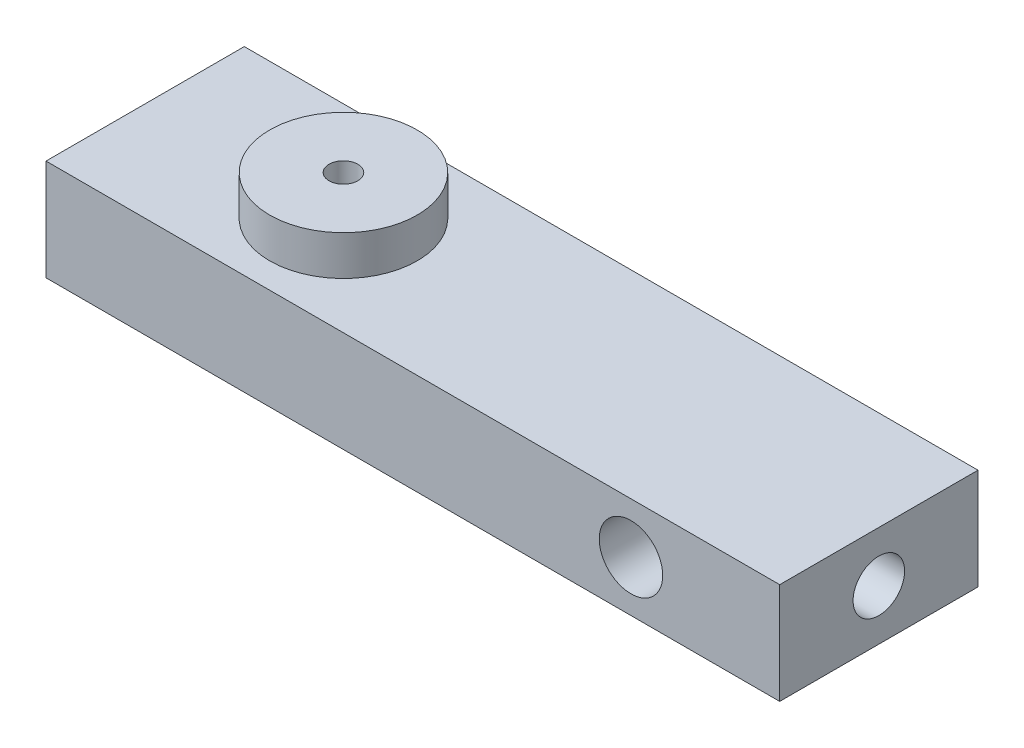
ISO-10303-21;
HEADER;
FILE_DESCRIPTION(('STEP AP214'),'2;1');
FILE_NAME('part.step','',(''),(''),'','','');
FILE_SCHEMA(('AUTOMOTIVE_DESIGN { 1 0 10303 214 1 1 1 1 }'));
ENDSEC;
DATA;
#1=APPLICATION_CONTEXT('core data for automotive mechanical design processes');
#2=APPLICATION_PROTOCOL_DEFINITION('international standard','automotive_design',2000,#1);
#3=PRODUCT_CONTEXT('',#1,'mechanical');
#4=PRODUCT('Part','Part','',(#3));
#5=PRODUCT_RELATED_PRODUCT_CATEGORY('part','',(#4));
#6=PRODUCT_DEFINITION_FORMATION('','',#4);
#7=PRODUCT_DEFINITION_CONTEXT('part definition',#1,'design');
#8=PRODUCT_DEFINITION('design','',#6,#7);
#9=PRODUCT_DEFINITION_SHAPE('','',#8);
#10=(LENGTH_UNIT() NAMED_UNIT(*) SI_UNIT(.MILLI.,.METRE.));
#11=(NAMED_UNIT(*) PLANE_ANGLE_UNIT() SI_UNIT($,.RADIAN.));
#12=(NAMED_UNIT(*) SI_UNIT($,.STERADIAN.) SOLID_ANGLE_UNIT());
#13=UNCERTAINTY_MEASURE_WITH_UNIT(LENGTH_MEASURE(1.E-05),#10,'distance_accuracy_value','');
#14=(GEOMETRIC_REPRESENTATION_CONTEXT(3) GLOBAL_UNCERTAINTY_ASSIGNED_CONTEXT((#13)) GLOBAL_UNIT_ASSIGNED_CONTEXT((#10,
#11,#12)) REPRESENTATION_CONTEXT('',''));
#15=CARTESIAN_POINT('',(0.,0.,0.));
#16=DIRECTION('',(0.,0.,1.));
#17=DIRECTION('',(1.,0.,0.));
#18=AXIS2_PLACEMENT_3D('',#15,#16,#17);
#19=CARTESIAN_POINT('',(7.5,5.1,-5.));
#20=DIRECTION('',(-1.,0.,0.));
#21=DIRECTION('',(0.,0.,1.));
#22=AXIS2_PLACEMENT_3D('',#19,#20,#21);
#23=PLANE('',#22);
#24=CARTESIAN_POINT('',(7.5,2.55,0.));
#25=DIRECTION('',(1.,0.,0.));
#26=DIRECTION('',(0.,0.,-1.));
#27=AXIS2_PLACEMENT_3D('',#24,#25,#26);
#28=CIRCLE('',#27,1.3);
#29=CARTESIAN_POINT('',(7.5,2.55,-1.3));
#30=VERTEX_POINT('',#29);
#31=EDGE_CURVE('E157',#30,#30,#28,.T.);
#32=ORIENTED_EDGE('',*,*,#31,.F.);
#33=EDGE_LOOP('',(#32));
#34=FACE_BOUND('',#33,.T.);
#35=DIRECTION('',(0.,0.,-1.));
#36=VECTOR('',#35,1.);
#37=CARTESIAN_POINT('',(7.5,0.,-5.));
#38=LINE('',#37,#36);
#39=CARTESIAN_POINT('',(7.5,0.,5.));
#40=VERTEX_POINT('',#39);
#41=CARTESIAN_POINT('',(7.5,0.,-5.));
#42=VERTEX_POINT('',#41);
#43=EDGE_CURVE('E88',#40,#42,#38,.T.);
#44=ORIENTED_EDGE('',*,*,#43,.T.);
#45=DIRECTION('',(0.,-1.,0.));
#46=VECTOR('',#45,1.);
#47=CARTESIAN_POINT('',(7.5,5.1,-5.));
#48=LINE('',#47,#46);
#49=CARTESIAN_POINT('',(7.5,5.1,-5.));
#50=VERTEX_POINT('',#49);
#51=EDGE_CURVE('E11',#50,#42,#48,.T.);
#52=ORIENTED_EDGE('',*,*,#51,.F.);
#53=DIRECTION('',(0.,0.,-1.));
#54=VECTOR('',#53,1.);
#55=CARTESIAN_POINT('',(7.5,5.1,-5.));
#56=LINE('',#55,#54);
#57=CARTESIAN_POINT('',(7.5,5.1,5.));
#58=VERTEX_POINT('',#57);
#59=EDGE_CURVE('E171',#58,#50,#56,.T.);
#60=ORIENTED_EDGE('',*,*,#59,.F.);
#61=DIRECTION('',(0.,-1.,0.));
#62=VECTOR('',#61,1.);
#63=CARTESIAN_POINT('',(7.5,5.1,5.));
#64=LINE('',#63,#62);
#65=EDGE_CURVE('E47',#58,#40,#64,.T.);
#66=ORIENTED_EDGE('',*,*,#65,.T.);
#67=EDGE_LOOP('',(#44,#52,#60,#66));
#68=FACE_BOUND('',#67,.T.);
#69=ADVANCED_FACE('F38',(#34,#68),#23,.F.);
#70=CARTESIAN_POINT('',(-7.5,5.1,-5.));
#71=DIRECTION('',(0.,0.,1.));
#72=DIRECTION('',(1.,0.,0.));
#73=AXIS2_PLACEMENT_3D('',#70,#71,#72);
#74=PLANE('',#73);
#75=CARTESIAN_POINT('',(0.,2.55,-5.));
#76=DIRECTION('',(0.,0.,1.));
#77=DIRECTION('',(1.,0.,0.));
#78=AXIS2_PLACEMENT_3D('',#75,#76,#77);
#79=CIRCLE('',#78,1.6);
#80=CARTESIAN_POINT('',(1.6,2.55,-5.));
#81=VERTEX_POINT('',#80);
#82=EDGE_CURVE('E161',#81,#81,#79,.T.);
#83=ORIENTED_EDGE('',*,*,#82,.T.);
#84=EDGE_LOOP('',(#83));
#85=FACE_BOUND('',#84,.T.);
#86=DIRECTION('',(-1.,0.,0.));
#87=VECTOR('',#86,1.);
#88=CARTESIAN_POINT('',(-7.5,0.,-5.));
#89=LINE('',#88,#87);
#90=CARTESIAN_POINT('',(-29.5,0.,-5.));
#91=VERTEX_POINT('',#90);
#92=EDGE_CURVE('E67',#42,#91,#89,.T.);
#93=ORIENTED_EDGE('',*,*,#92,.T.);
#94=DIRECTION('',(0.,-1.,0.));
#95=VECTOR('',#94,1.);
#96=CARTESIAN_POINT('',(-29.5,5.1,-5.));
#97=LINE('',#96,#95);
#98=CARTESIAN_POINT('',(-29.5,5.1,-5.));
#99=VERTEX_POINT('',#98);
#100=EDGE_CURVE('E83',#99,#91,#97,.T.);
#101=ORIENTED_EDGE('',*,*,#100,.F.);
#102=DIRECTION('',(-1.,0.,0.));
#103=VECTOR('',#102,1.);
#104=CARTESIAN_POINT('',(-7.5,5.1,-5.));
#105=LINE('',#104,#103);
#106=EDGE_CURVE('E71',#50,#99,#105,.T.);
#107=ORIENTED_EDGE('',*,*,#106,.F.);
#108=ORIENTED_EDGE('',*,*,#51,.T.);
#109=EDGE_LOOP('',(#93,#101,#107,#108));
#110=FACE_BOUND('',#109,.T.);
#111=ADVANCED_FACE('F81',(#85,#110),#74,.F.);
#112=CARTESIAN_POINT('',(-7.5,5.1,5.));
#113=DIRECTION('',(0.,0.,-1.));
#114=DIRECTION('',(-1.,0.,0.));
#115=AXIS2_PLACEMENT_3D('',#112,#113,#114);
#116=PLANE('',#115);
#117=CARTESIAN_POINT('',(0.,2.55,5.));
#118=DIRECTION('',(0.,0.,1.));
#119=DIRECTION('',(1.,0.,0.));
#120=AXIS2_PLACEMENT_3D('',#117,#118,#119);
#121=CIRCLE('',#120,1.6);
#122=CARTESIAN_POINT('',(1.6,2.55,5.));
#123=VERTEX_POINT('',#122);
#124=EDGE_CURVE('E165',#123,#123,#121,.T.);
#125=ORIENTED_EDGE('',*,*,#124,.F.);
#126=EDGE_LOOP('',(#125));
#127=FACE_BOUND('',#126,.T.);
#128=DIRECTION('',(1.,0.,0.));
#129=VECTOR('',#128,1.);
#130=CARTESIAN_POINT('',(-7.5,0.,5.));
#131=LINE('',#130,#129);
#132=CARTESIAN_POINT('',(-29.5,0.,5.));
#133=VERTEX_POINT('',#132);
#134=EDGE_CURVE('E87',#133,#40,#131,.T.);
#135=ORIENTED_EDGE('',*,*,#134,.T.);
#136=ORIENTED_EDGE('',*,*,#65,.F.);
#137=DIRECTION('',(1.,0.,0.));
#138=VECTOR('',#137,1.);
#139=CARTESIAN_POINT('',(-7.5,5.1,5.));
#140=LINE('',#139,#138);
#141=CARTESIAN_POINT('',(-29.5,5.1,5.));
#142=VERTEX_POINT('',#141);
#143=EDGE_CURVE('E55',#142,#58,#140,.T.);
#144=ORIENTED_EDGE('',*,*,#143,.F.);
#145=DIRECTION('',(0.,1.,0.));
#146=VECTOR('',#145,1.);
#147=CARTESIAN_POINT('',(-29.5,0.,5.));
#148=LINE('',#147,#146);
#149=EDGE_CURVE('E97',#133,#142,#148,.T.);
#150=ORIENTED_EDGE('',*,*,#149,.F.);
#151=EDGE_LOOP('',(#135,#136,#144,#150));
#152=FACE_BOUND('',#151,.T.);
#153=ADVANCED_FACE('F152',(#127,#152),#116,.F.);
#154=CARTESIAN_POINT('',(0.,5.1,0.));
#155=DIRECTION('',(0.,1.,0.));
#156=DIRECTION('',(0.,0.,1.));
#157=AXIS2_PLACEMENT_3D('',#154,#155,#156);
#158=PLANE('',#157);
#159=CARTESIAN_POINT('',(-19.5,5.1,0.));
#160=DIRECTION('',(0.,1.,0.));
#161=DIRECTION('',(0.,0.,1.));
#162=AXIS2_PLACEMENT_3D('',#159,#160,#161);
#163=CIRCLE('',#162,3.72);
#164=CARTESIAN_POINT('',(-19.5,5.1,3.72));
#165=VERTEX_POINT('',#164);
#166=EDGE_CURVE('E106',#165,#165,#163,.T.);
#167=ORIENTED_EDGE('',*,*,#166,.F.);
#168=EDGE_LOOP('',(#167));
#169=FACE_BOUND('',#168,.T.);
#170=ORIENTED_EDGE('',*,*,#59,.T.);
#171=ORIENTED_EDGE('',*,*,#106,.T.);
#172=DIRECTION('',(0.,0.,-1.));
#173=VECTOR('',#172,1.);
#174=CARTESIAN_POINT('',(-29.5,5.1,5.));
#175=LINE('',#174,#173);
#176=EDGE_CURVE('E100',#142,#99,#175,.T.);
#177=ORIENTED_EDGE('',*,*,#176,.F.);
#178=ORIENTED_EDGE('',*,*,#143,.T.);
#179=EDGE_LOOP('',(#170,#171,#177,#178));
#180=FACE_BOUND('',#179,.T.);
#181=ADVANCED_FACE('F202',(#169,#180),#158,.T.);
#182=CARTESIAN_POINT('',(0.,0.,0.));
#183=DIRECTION('',(0.,1.,0.));
#184=DIRECTION('',(0.,0.,1.));
#185=AXIS2_PLACEMENT_3D('',#182,#183,#184);
#186=PLANE('',#185);
#187=CARTESIAN_POINT('',(-19.5,0.,0.));
#188=DIRECTION('',(0.,1.,0.));
#189=DIRECTION('',(0.,0.,1.));
#190=AXIS2_PLACEMENT_3D('',#187,#188,#189);
#191=CIRCLE('',#190,0.725);
#192=CARTESIAN_POINT('',(-19.5,0.,0.725));
#193=VERTEX_POINT('',#192);
#194=EDGE_CURVE('E308',#193,#193,#191,.T.);
#195=ORIENTED_EDGE('',*,*,#194,.T.);
#196=EDGE_LOOP('',(#195));
#197=FACE_BOUND('',#196,.T.);
#198=ORIENTED_EDGE('',*,*,#43,.F.);
#199=ORIENTED_EDGE('',*,*,#134,.F.);
#200=DIRECTION('',(0.,0.,1.));
#201=VECTOR('',#200,1.);
#202=CARTESIAN_POINT('',(-29.5,0.,-5.));
#203=LINE('',#202,#201);
#204=EDGE_CURVE('E91',#91,#133,#203,.T.);
#205=ORIENTED_EDGE('',*,*,#204,.F.);
#206=ORIENTED_EDGE('',*,*,#92,.F.);
#207=EDGE_LOOP('',(#198,#199,#205,#206));
#208=FACE_BOUND('',#207,.T.);
#209=ADVANCED_FACE('F92',(#197,#208),#186,.F.);
#210=CARTESIAN_POINT('',(0.,2.55,-5.));
#211=DIRECTION('',(0.,0.,1.));
#212=DIRECTION('',(1.,0.,0.));
#213=AXIS2_PLACEMENT_3D('',#210,#211,#212);
#214=CYLINDRICAL_SURFACE('',#213,1.6);
#215=CARTESIAN_POINT('',(1.6,2.55,-0.575));
#216=CARTESIAN_POINT('',(1.60000050848022,2.51876950559372,-0.575000703116482));
#217=CARTESIAN_POINT('',(1.59907746887212,2.48754399785527,-0.572447532186191));
#218=CARTESIAN_POINT('',(1.59548698202028,2.42602110960908,-0.56233968613379));
#219=CARTESIAN_POINT('',(1.59281962457341,2.39572368140817,-0.554785268473904));
#220=CARTESIAN_POINT('',(1.58602819566392,2.3369528443925,-0.534973175694512));
#221=CARTESIAN_POINT('',(1.58190679254388,2.30847620653527,-0.522724112263412));
#222=CARTESIAN_POINT('',(1.57262165183787,2.25398282368175,-0.493912354762376));
#223=CARTESIAN_POINT('',(1.56745766069616,2.227966679338,-0.477348611084163));
#224=CARTESIAN_POINT('',(1.55639653521282,2.17810551570974,-0.439693044044112));
#225=CARTESIAN_POINT('',(1.55047984690046,2.15437074608225,-0.41846102510401));
#226=CARTESIAN_POINT('',(1.53868066195895,2.1107116824926,-0.372369329098642));
#227=CARTESIAN_POINT('',(1.53279817500993,2.09078842083366,-0.347508672463478));
#228=CARTESIAN_POINT('',(1.52151080468376,2.05464511832147,-0.293821223420627));
#229=CARTESIAN_POINT('',(1.51612929847291,2.03857596703836,-0.26488744956286));
#230=CARTESIAN_POINT('',(1.50675477543481,2.0115802941203,-0.204503778235171));
#231=CARTESIAN_POINT('',(1.50276125549563,2.00065190857156,-0.173054797563123));
#232=CARTESIAN_POINT('',(1.49682268207155,1.98467493191648,-0.109797426572945));
#233=CARTESIAN_POINT('',(1.49480507491347,1.97941730430619,-0.0780488631075839));
#234=CARTESIAN_POINT('',(1.492833494102,1.97427742205493,-0.0140609639627082));
#235=CARTESIAN_POINT('',(1.49287875507453,1.97439317376032,0.0181781852595003));
#236=CARTESIAN_POINT('',(1.49496483898098,1.979835986849,0.0803719103053698));
#237=CARTESIAN_POINT('',(1.49689727836497,1.98488001723853,0.110355547797764));
#238=CARTESIAN_POINT('',(1.50236093239943,1.99957070667126,0.169018417895657));
#239=CARTESIAN_POINT('',(1.50589236813211,2.00921800218614,0.197697469521444));
#240=CARTESIAN_POINT('',(1.51422589703627,2.03300807086108,0.253539299394918));
#241=CARTESIAN_POINT('',(1.51904960582178,2.04722823051598,0.280665742064256));
#242=CARTESIAN_POINT('',(1.52941625088347,2.07970655062852,0.332232357347461));
#243=CARTESIAN_POINT('',(1.53495942036609,2.09796602174868,0.356671654182978));
#244=CARTESIAN_POINT('',(1.54655543660516,2.13932446438426,0.403746477475306));
#245=CARTESIAN_POINT('',(1.55261869343905,2.16265153931204,0.426179495108066));
#246=CARTESIAN_POINT('',(1.56427752502767,2.21280863216884,0.466872595705891));
#247=CARTESIAN_POINT('',(1.56987303910187,2.23963910344221,0.485132137774929));
#248=CARTESIAN_POINT('',(1.58006156395632,2.29652394538056,0.517159266945663));
#249=CARTESIAN_POINT('',(1.58464040681923,2.32661610885396,0.530864552064318));
#250=CARTESIAN_POINT('',(1.59217557088174,2.38888389671438,0.552952662760458));
#251=CARTESIAN_POINT('',(1.5951325514512,2.42105866845793,0.561337651527926));
#252=CARTESIAN_POINT('',(1.59897748647025,2.48487007617423,0.572169743648096));
#253=CARTESIAN_POINT('',(1.59996049684922,2.51645468563876,0.574889894823188));
#254=CARTESIAN_POINT('',(1.60003712063751,2.57964040106482,0.575103475521332));
#255=CARTESIAN_POINT('',(1.59913111302775,2.61124150244605,0.572597953435887));
#256=CARTESIAN_POINT('',(1.59559431878588,2.67241712819422,0.562642399374702));
#257=CARTESIAN_POINT('',(1.59302443425764,2.70202392779867,0.555366848124368));
#258=CARTESIAN_POINT('',(1.58647914641158,2.75957941952705,0.536302982595821));
#259=CARTESIAN_POINT('',(1.58250356047261,2.78752789565935,0.524514081951115));
#260=CARTESIAN_POINT('',(1.57340345933439,2.84185996795856,0.496392002318815));
#261=CARTESIAN_POINT('',(1.56824955041595,2.86817667950566,0.479939397357719));
#262=CARTESIAN_POINT('',(1.55736883934702,2.91776040386426,0.443093818789814));
#263=CARTESIAN_POINT('',(1.55164183904692,2.9410263553897,0.422699480020255));
#264=CARTESIAN_POINT('',(1.53987093336245,2.98513962523005,0.37727078984231));
#265=CARTESIAN_POINT('',(1.53382636840347,3.0057925748739,0.352047386795197));
#266=CARTESIAN_POINT('',(1.52240352755619,3.04260545505542,0.298368769841877));
#267=CARTESIAN_POINT('',(1.51702528726837,3.05876514558399,0.269913383412381));
#268=CARTESIAN_POINT('',(1.50758047664489,3.08610804134641,0.210440677446993));
#269=CARTESIAN_POINT('',(1.50351577160119,3.0972841781358,0.179419792535327));
#270=CARTESIAN_POINT('',(1.49725518959262,3.11418945864788,0.115751947660128));
#271=CARTESIAN_POINT('',(1.49505828290862,3.11992160385302,0.083105894176319));
#272=CARTESIAN_POINT('',(1.49291142107151,3.12552028647244,0.0192008486922548));
#273=CARTESIAN_POINT('',(1.49283583907789,3.12571477938626,-0.0120254613139569));
#274=CARTESIAN_POINT('',(1.49462250280095,3.12106011770636,-0.0740404171482503));
#275=CARTESIAN_POINT('',(1.49648459396689,3.11621136536689,-0.104829097683559));
#276=CARTESIAN_POINT('',(1.50183628738895,3.10185482014829,-0.164296530149276));
#277=CARTESIAN_POINT('',(1.50528280328148,3.09247005100604,-0.193009180628924));
#278=CARTESIAN_POINT('',(1.51339328258353,3.06941256432135,-0.248471636084732));
#279=CARTESIAN_POINT('',(1.51805754085538,3.05573880808819,-0.275220963652289));
#280=CARTESIAN_POINT('',(1.52836370725024,3.02370907177732,-0.327426540976942));
#281=CARTESIAN_POINT('',(1.53404242472571,3.00515582893766,-0.352754424824735));
#282=CARTESIAN_POINT('',(1.54560096415055,2.96420980015171,-0.400042628356791));
#283=CARTESIAN_POINT('',(1.55148084685939,2.94181584582228,-0.422001919418773));
#284=CARTESIAN_POINT('',(1.56311841941566,2.89253604868526,-0.46300062424063));
#285=CARTESIAN_POINT('',(1.5688566747583,2.86548611591526,-0.481849128630608));
#286=CARTESIAN_POINT('',(1.57926174757605,2.80840446522642,-0.51471978565845));
#287=CARTESIAN_POINT('',(1.58392862653151,2.77837291854762,-0.528742215261063));
#288=CARTESIAN_POINT('',(1.59169242403267,2.71587446359602,-0.551567499047618));
#289=CARTESIAN_POINT('',(1.59477488465317,2.68338812663372,-0.56032240578293));
#290=CARTESIAN_POINT('',(1.59892799377825,2.61726561992664,-0.572037110815618));
#291=CARTESIAN_POINT('',(1.59999945245348,2.58362991878844,-0.574999242863405));
#292=CARTESIAN_POINT('',(1.6,2.55,-0.575));
#293=B_SPLINE_CURVE_WITH_KNOTS('',3,(#215,#216,#217,#218,#219,#220,#221,#222,#223,#224,#225,
#226,#227,#228,#229,#230,#231,#232,#233,#234,#235,#236,#237,#238,#239,#240,#241,#242,#243,#244,
#245,#246,#247,#248,#249,#250,#251,#252,#253,#254,#255,#256,#257,#258,#259,#260,#261,#262,#263,
#264,#265,#266,#267,#268,#269,#270,#271,#272,#273,#274,#275,#276,#277,#278,#279,#280,#281,#282,
#283,#284,#285,#286,#287,#288,#289,#290,#291,#292),.UNSPECIFIED.,.T.,.F.,(4,2,2,2,2,2,2,2,2,2,2,
2,2,2,2,2,2,2,2,2,2,2,2,2,2,2,2,2,2,2,2,2,2,2,2,2,2,2,4),(0.,0.0935675457078228,
0.187130274969539,0.280522191284918,0.373936847783771,0.470676735992777,0.567442788112722,
0.667536112098638,0.767593116709176,0.863820495215789,0.960012171323757,1.05098587658739,
1.14197216400118,1.23458729307956,1.32723251780535,1.42555887098333,1.52389796036016,
1.62353169774568,1.72312489884662,1.81779471290386,1.91244553582319,2.00381402123083,
2.09519438110339,2.18916704085329,2.28317230519053,2.38217575182213,2.48118448574416,
2.58033320588447,2.67942722972459,2.7726395891547,2.86584451444461,2.95665248106322,
3.0474824562145,3.14278117332156,3.23810893284895,3.33801547788619,3.43791628840662,
3.53871320189027,3.63946949868315),.UNSPECIFIED.);
#294=CARTESIAN_POINT('',(1.6,2.55,-0.575));
#295=VERTEX_POINT('',#294);
#296=EDGE_CURVE('E114',#295,#295,#293,.T.);
#297=ORIENTED_EDGE('',*,*,#296,.F.);
#298=EDGE_LOOP('',(#297));
#299=FACE_BOUND('',#298,.T.);
#300=ORIENTED_EDGE('',*,*,#82,.F.);
#301=EDGE_LOOP('',(#300));
#302=FACE_BOUND('',#301,.T.);
#303=ORIENTED_EDGE('',*,*,#124,.T.);
#304=EDGE_LOOP('',(#303));
#305=FACE_BOUND('',#304,.T.);
#306=ADVANCED_FACE('F192',(#299,#302,#305),#214,.F.);
#307=CARTESIAN_POINT('',(3.7,2.55,0.));
#308=DIRECTION('',(1.,0.,0.));
#309=DIRECTION('',(0.,0.,-1.));
#310=AXIS2_PLACEMENT_3D('',#307,#308,#309);
#311=CYLINDRICAL_SURFACE('',#310,1.3);
#312=CARTESIAN_POINT('',(3.7,2.55,0.));
#313=DIRECTION('',(1.,0.,0.));
#314=DIRECTION('',(0.,0.,-1.));
#315=AXIS2_PLACEMENT_3D('',#312,#313,#314);
#316=CIRCLE('',#315,1.3);
#317=CARTESIAN_POINT('',(3.7,2.55,-1.3));
#318=VERTEX_POINT('',#317);
#319=EDGE_CURVE('E180',#318,#318,#316,.T.);
#320=CARTESIAN_POINT('',(3.7,2.55,-1.3));
#321=CARTESIAN_POINT('',(3.73958333333333,2.55,-1.3));
#322=CARTESIAN_POINT('',(3.77916666666666,2.55,-1.3));
#323=CARTESIAN_POINT('',(3.85833333333333,2.55,-1.3));
#324=CARTESIAN_POINT('',(3.89791666666666,2.55,-1.3));
#325=CARTESIAN_POINT('',(3.97708333333333,2.55,-1.3));
#326=CARTESIAN_POINT('',(4.01666666666666,2.55,-1.3));
#327=CARTESIAN_POINT('',(4.09583333333333,2.55,-1.3));
#328=CARTESIAN_POINT('',(4.13541666666666,2.55,-1.3));
#329=CARTESIAN_POINT('',(4.21458333333333,2.55,-1.3));
#330=CARTESIAN_POINT('',(4.25416666666666,2.55,-1.3));
#331=CARTESIAN_POINT('',(4.33333333333333,2.55,-1.3));
#332=CARTESIAN_POINT('',(4.37291666666667,2.55,-1.3));
#333=CARTESIAN_POINT('',(4.45208333333333,2.55,-1.3));
#334=CARTESIAN_POINT('',(4.49166666666666,2.55,-1.3));
#335=CARTESIAN_POINT('',(4.57083333333333,2.55,-1.3));
#336=CARTESIAN_POINT('',(4.61041666666666,2.55,-1.3));
#337=CARTESIAN_POINT('',(4.68958333333333,2.55,-1.3));
#338=CARTESIAN_POINT('',(4.72916666666666,2.55,-1.3));
#339=CARTESIAN_POINT('',(4.80833333333333,2.55,-1.3));
#340=CARTESIAN_POINT('',(4.84791666666666,2.55,-1.3));
#341=CARTESIAN_POINT('',(4.92708333333333,2.55,-1.3));
#342=CARTESIAN_POINT('',(4.96666666666666,2.55,-1.3));
#343=CARTESIAN_POINT('',(5.04583333333333,2.55,-1.3));
#344=CARTESIAN_POINT('',(5.08541666666666,2.55,-1.3));
#345=CARTESIAN_POINT('',(5.16458333333333,2.55,-1.3));
#346=CARTESIAN_POINT('',(5.20416666666666,2.55,-1.3));
#347=CARTESIAN_POINT('',(5.28333333333333,2.55,-1.3));
#348=CARTESIAN_POINT('',(5.32291666666666,2.55,-1.3));
#349=CARTESIAN_POINT('',(5.40208333333333,2.55,-1.3));
#350=CARTESIAN_POINT('',(5.44166666666666,2.55,-1.3));
#351=CARTESIAN_POINT('',(5.52083333333333,2.55,-1.3));
#352=CARTESIAN_POINT('',(5.56041666666666,2.55,-1.3));
#353=CARTESIAN_POINT('',(5.63958333333333,2.55,-1.3));
#354=CARTESIAN_POINT('',(5.67916666666666,2.55,-1.3));
#355=CARTESIAN_POINT('',(5.75833333333333,2.55,-1.3));
#356=CARTESIAN_POINT('',(5.79791666666666,2.55,-1.3));
#357=CARTESIAN_POINT('',(5.87708333333333,2.55,-1.3));
#358=CARTESIAN_POINT('',(5.91666666666666,2.55,-1.3));
#359=CARTESIAN_POINT('',(5.99583333333333,2.55,-1.3));
#360=CARTESIAN_POINT('',(6.03541666666666,2.55,-1.3));
#361=CARTESIAN_POINT('',(6.11458333333333,2.55,-1.3));
#362=CARTESIAN_POINT('',(6.15416666666666,2.55,-1.3));
#363=CARTESIAN_POINT('',(6.23333333333333,2.55,-1.3));
#364=CARTESIAN_POINT('',(6.27291666666666,2.55,-1.3));
#365=CARTESIAN_POINT('',(6.35208333333333,2.55,-1.3));
#366=CARTESIAN_POINT('',(6.39166666666666,2.55,-1.3));
#367=CARTESIAN_POINT('',(6.47083333333333,2.55,-1.3));
#368=CARTESIAN_POINT('',(6.51041666666666,2.55,-1.3));
#369=CARTESIAN_POINT('',(6.58958333333333,2.55,-1.3));
#370=CARTESIAN_POINT('',(6.62916666666666,2.55,-1.3));
#371=CARTESIAN_POINT('',(6.70833333333333,2.55,-1.3));
#372=CARTESIAN_POINT('',(6.74791666666666,2.55,-1.3));
#373=CARTESIAN_POINT('',(6.82708333333333,2.55,-1.3));
#374=CARTESIAN_POINT('',(6.86666666666666,2.55,-1.3));
#375=CARTESIAN_POINT('',(6.94583333333333,2.55,-1.3));
#376=CARTESIAN_POINT('',(6.98541666666666,2.55,-1.3));
#377=CARTESIAN_POINT('',(7.06458333333333,2.55,-1.3));
#378=CARTESIAN_POINT('',(7.10416666666666,2.55,-1.3));
#379=CARTESIAN_POINT('',(7.18333333333333,2.55,-1.3));
#380=CARTESIAN_POINT('',(7.22291666666666,2.55,-1.3));
#381=CARTESIAN_POINT('',(7.30208333333333,2.55,-1.3));
#382=CARTESIAN_POINT('',(7.34166666666666,2.55,-1.3));
#383=CARTESIAN_POINT('',(7.42083333333333,2.55,-1.3));
#384=CARTESIAN_POINT('',(7.46041666666666,2.55,-1.3));
#385=CARTESIAN_POINT('',(7.5,2.55,-1.3));
#386=B_SPLINE_CURVE_WITH_KNOTS('',3,(#320,#321,#322,#323,#324,#325,#326,#327,#328,#329,#330,
#331,#332,#333,#334,#335,#336,#337,#338,#339,#340,#341,#342,#343,#344,#345,#346,#347,#348,#349,
#350,#351,#352,#353,#354,#355,#356,#357,#358,#359,#360,#361,#362,#363,#364,#365,#366,#367,#368,
#369,#370,#371,#372,#373,#374,#375,#376,#377,#378,#379,#380,#381,#382,#383,#384,#385),
.UNSPECIFIED.,.F.,.F.,(4,2,2,2,2,2,2,2,2,2,2,2,2,2,2,2,2,2,2,2,2,2,2,2,2,2,2,2,2,2,2,2,4),(0.,
0.11875,0.237499999999999,0.356249999999999,0.474999999999999,0.593749999999999,0.7125,0.83125,
0.95,1.06875,1.1875,1.30625,1.425,1.54375,1.6625,1.78125,1.9,2.01875,2.1375,2.25625,2.375,
2.49375,2.6125,2.73125,2.85,2.96875,3.0875,3.20625,3.325,3.44375,3.5625,3.68125,3.8),.UNSPECIFIED.);
#387=EDGE_CURVE('BSEAM189',#318,#30,#386,.T.);
#388=ORIENTED_EDGE('',*,*,#319,.F.);
#389=ORIENTED_EDGE('',*,*,#31,.T.);
#390=ORIENTED_EDGE('',*,*,#387,.T.);
#391=ORIENTED_EDGE('',*,*,#387,.F.);
#392=EDGE_LOOP('',(#388,#390,#389,#391));
#393=FACE_BOUND('',#392,.T.);
#394=ADVANCED_FACE('F189',(#393),#311,.F.);
#395=CARTESIAN_POINT('',(3.7,2.55,0.));
#396=DIRECTION('',(1.,0.,0.));
#397=DIRECTION('',(0.,0.,-1.));
#398=AXIS2_PLACEMENT_3D('',#395,#396,#397);
#399=PLANE('',#398);
#400=CARTESIAN_POINT('',(3.7,2.55,0.));
#401=DIRECTION('',(1.,0.,0.));
#402=DIRECTION('',(0.,0.,-1.));
#403=AXIS2_PLACEMENT_3D('',#400,#401,#402);
#404=CIRCLE('',#403,0.575);
#405=CARTESIAN_POINT('',(3.7,2.55,-0.575));
#406=VERTEX_POINT('',#405);
#407=EDGE_CURVE('E123',#406,#406,#404,.T.);
#408=ORIENTED_EDGE('',*,*,#407,.F.);
#409=EDGE_LOOP('',(#408));
#410=FACE_BOUND('',#409,.T.);
#411=ORIENTED_EDGE('',*,*,#319,.T.);
#412=EDGE_LOOP('',(#411));
#413=FACE_BOUND('',#412,.T.);
#414=ADVANCED_FACE('F187',(#410,#413),#399,.T.);
#415=CARTESIAN_POINT('',(-7.501,2.55,0.));
#416=DIRECTION('',(1.,0.,0.));
#417=DIRECTION('',(0.,0.,-1.));
#418=AXIS2_PLACEMENT_3D('',#415,#416,#417);
#419=CYLINDRICAL_SURFACE('',#418,0.575);
#420=ORIENTED_EDGE('',*,*,#407,.T.);
#421=EDGE_LOOP('',(#420));
#422=FACE_BOUND('',#421,.T.);
#423=ORIENTED_EDGE('',*,*,#296,.T.);
#424=EDGE_LOOP('',(#423));
#425=FACE_BOUND('',#424,.T.);
#426=ADVANCED_FACE('F125',(#422,#425),#419,.F.);
#427=CARTESIAN_POINT('',(-29.5,0.,0.));
#428=DIRECTION('',(-1.,0.,0.));
#429=DIRECTION('',(0.,0.,1.));
#430=AXIS2_PLACEMENT_3D('',#427,#428,#429);
#431=PLANE('',#430);
#432=ORIENTED_EDGE('',*,*,#100,.T.);
#433=ORIENTED_EDGE('',*,*,#204,.T.);
#434=ORIENTED_EDGE('',*,*,#149,.T.);
#435=ORIENTED_EDGE('',*,*,#176,.T.);
#436=EDGE_LOOP('',(#432,#433,#434,#435));
#437=FACE_BOUND('',#436,.T.);
#438=ADVANCED_FACE('F99',(#437),#431,.T.);
#439=CARTESIAN_POINT('',(-19.5,7.1,0.));
#440=DIRECTION('',(0.,-1.,0.));
#441=DIRECTION('',(0.,0.,-1.));
#442=AXIS2_PLACEMENT_3D('',#439,#440,#441);
#443=CYLINDRICAL_SURFACE('',#442,3.72);
#444=CARTESIAN_POINT('',(-19.5,7.1,0.));
#445=DIRECTION('',(0.,1.,0.));
#446=DIRECTION('',(0.,0.,1.));
#447=AXIS2_PLACEMENT_3D('',#444,#445,#446);
#448=CIRCLE('',#447,3.72);
#449=CARTESIAN_POINT('',(-19.5,7.1,3.72));
#450=VERTEX_POINT('',#449);
#451=EDGE_CURVE('E102',#450,#450,#448,.T.);
#452=ORIENTED_EDGE('',*,*,#451,.F.);
#453=EDGE_LOOP('',(#452));
#454=FACE_BOUND('',#453,.T.);
#455=ORIENTED_EDGE('',*,*,#166,.T.);
#456=EDGE_LOOP('',(#455));
#457=FACE_BOUND('',#456,.T.);
#458=ADVANCED_FACE('F132',(#454,#457),#443,.T.);
#459=CARTESIAN_POINT('',(-19.5,7.1,0.));
#460=DIRECTION('',(0.,1.,0.));
#461=DIRECTION('',(0.,0.,1.));
#462=AXIS2_PLACEMENT_3D('',#459,#460,#461);
#463=PLANE('',#462);
#464=CARTESIAN_POINT('',(-19.5,7.1,0.));
#465=DIRECTION('',(0.,1.,0.));
#466=DIRECTION('',(0.,0.,1.));
#467=AXIS2_PLACEMENT_3D('',#464,#465,#466);
#468=CIRCLE('',#467,0.725);
#469=CARTESIAN_POINT('',(-19.5,7.1,0.725));
#470=VERTEX_POINT('',#469);
#471=EDGE_CURVE('E310',#470,#470,#468,.T.);
#472=ORIENTED_EDGE('',*,*,#471,.F.);
#473=EDGE_LOOP('',(#472));
#474=FACE_BOUND('',#473,.T.);
#475=ORIENTED_EDGE('',*,*,#451,.T.);
#476=EDGE_LOOP('',(#475));
#477=FACE_BOUND('',#476,.T.);
#478=ADVANCED_FACE('F135',(#474,#477),#463,.T.);
#479=CARTESIAN_POINT('',(-19.5,0.,0.));
#480=DIRECTION('',(0.,1.,0.));
#481=DIRECTION('',(0.,0.,1.));
#482=AXIS2_PLACEMENT_3D('',#479,#480,#481);
#483=CYLINDRICAL_SURFACE('',#482,0.725);
#484=ORIENTED_EDGE('',*,*,#194,.F.);
#485=EDGE_LOOP('',(#484));
#486=FACE_BOUND('',#485,.T.);
#487=ORIENTED_EDGE('',*,*,#471,.T.);
#488=EDGE_LOOP('',(#487));
#489=FACE_BOUND('',#488,.T.);
#490=ADVANCED_FACE('F139',(#486,#489),#483,.F.);
#491=CLOSED_SHELL('',(#69,#111,#153,#181,#209,#306,#394,#414,#426,#438,#458,#478,#490));
#492=MANIFOLD_SOLID_BREP('B2',#491);
#493=ADVANCED_BREP_SHAPE_REPRESENTATION('',(#18,#492),#14);
#494=SHAPE_DEFINITION_REPRESENTATION(#9,#493);
ENDSEC;
END-ISO-10303-21;
